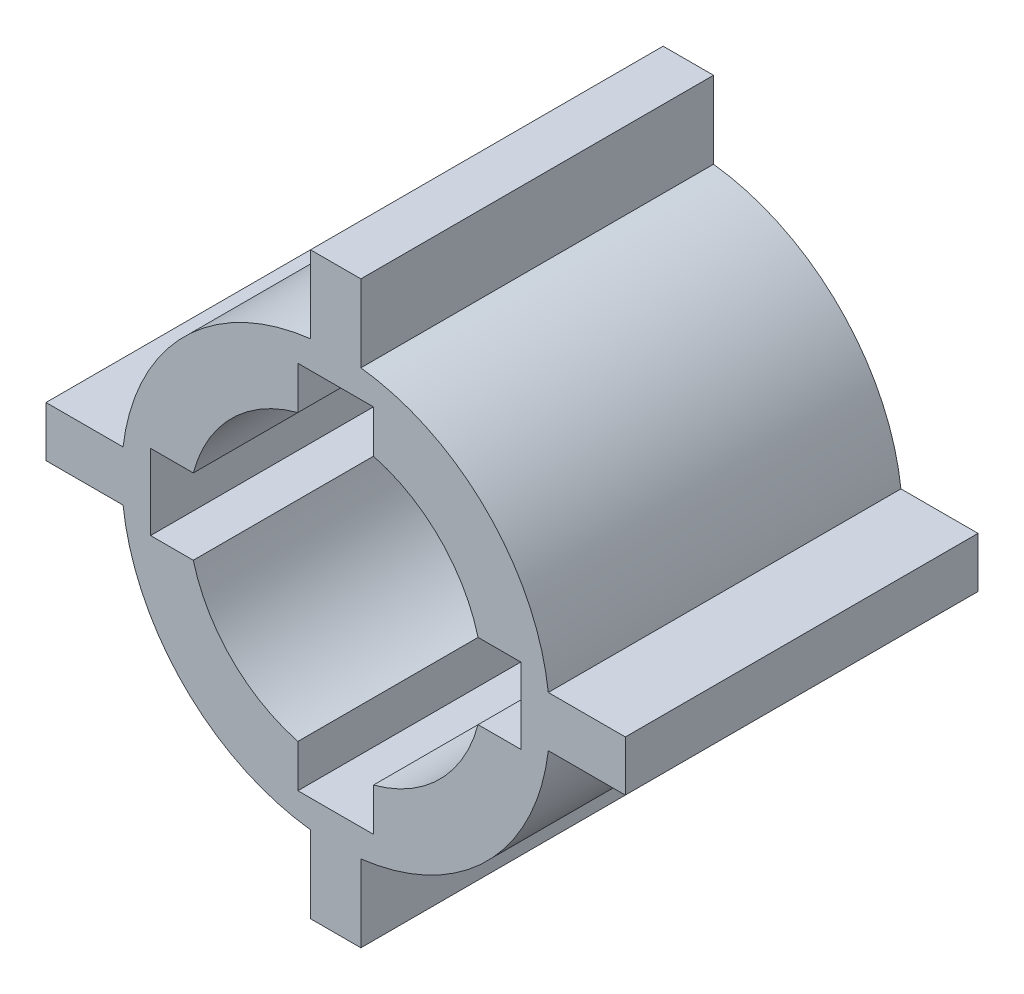
ISO-10303-21;
HEADER;
FILE_DESCRIPTION(('STEP AP214'),'2;1');
FILE_NAME('part.step','',(''),(''),'','','');
FILE_SCHEMA(('AUTOMOTIVE_DESIGN { 1 0 10303 214 1 1 1 1 }'));
ENDSEC;
DATA;
#1=APPLICATION_CONTEXT('core data for automotive mechanical design processes');
#2=APPLICATION_PROTOCOL_DEFINITION('international standard','automotive_design',2000,#1);
#3=PRODUCT_CONTEXT('',#1,'mechanical');
#4=PRODUCT('Part','Part','',(#3));
#5=PRODUCT_RELATED_PRODUCT_CATEGORY('part','',(#4));
#6=PRODUCT_DEFINITION_FORMATION('','',#4);
#7=PRODUCT_DEFINITION_CONTEXT('part definition',#1,'design');
#8=PRODUCT_DEFINITION('design','',#6,#7);
#9=PRODUCT_DEFINITION_SHAPE('','',#8);
#10=(LENGTH_UNIT() NAMED_UNIT(*) SI_UNIT(.MILLI.,.METRE.));
#11=(NAMED_UNIT(*) PLANE_ANGLE_UNIT() SI_UNIT($,.RADIAN.));
#12=(NAMED_UNIT(*) SI_UNIT($,.STERADIAN.) SOLID_ANGLE_UNIT());
#13=UNCERTAINTY_MEASURE_WITH_UNIT(LENGTH_MEASURE(1.E-05),#10,'distance_accuracy_value','');
#14=(GEOMETRIC_REPRESENTATION_CONTEXT(3) GLOBAL_UNCERTAINTY_ASSIGNED_CONTEXT((#13)) GLOBAL_UNIT_ASSIGNED_CONTEXT((#10,
#11,#12)) REPRESENTATION_CONTEXT('',''));
#15=CARTESIAN_POINT('',(0.,0.,0.));
#16=DIRECTION('',(0.,0.,1.));
#17=DIRECTION('',(1.,0.,0.));
#18=AXIS2_PLACEMENT_3D('',#15,#16,#17);
#19=CARTESIAN_POINT('',(0.,0.,14.));
#20=DIRECTION('',(0.,0.,1.));
#21=DIRECTION('',(1.,0.,0.));
#22=AXIS2_PLACEMENT_3D('',#19,#20,#21);
#23=PLANE('',#22);
#24=DIRECTION('',(0.,1.,0.));
#25=VECTOR('',#24,1.);
#26=CARTESIAN_POINT('',(1.,11.5,14.));
#27=LINE('',#26,#25);
#28=CARTESIAN_POINT('',(0.999999999999999,8.44097150806707,14.));
#29=VERTEX_POINT('',#28);
#30=CARTESIAN_POINT('',(1.,11.5,14.));
#31=VERTEX_POINT('',#30);
#32=EDGE_CURVE('E369',#29,#31,#27,.T.);
#33=ORIENTED_EDGE('',*,*,#32,.T.);
#34=DIRECTION('',(-1.,0.,0.));
#35=VECTOR('',#34,1.);
#36=CARTESIAN_POINT('',(-1.,11.5,14.));
#37=LINE('',#36,#35);
#38=CARTESIAN_POINT('',(-1.,11.5,14.));
#39=VERTEX_POINT('',#38);
#40=EDGE_CURVE('E372',#31,#39,#37,.T.);
#41=ORIENTED_EDGE('',*,*,#40,.T.);
#42=DIRECTION('',(0.,-1.,0.));
#43=VECTOR('',#42,1.);
#44=CARTESIAN_POINT('',(-1.,8.44097150806707,14.));
#45=LINE('',#44,#43);
#46=CARTESIAN_POINT('',(-1.,8.44097150806707,14.));
#47=VERTEX_POINT('',#46);
#48=EDGE_CURVE('E375',#39,#47,#45,.T.);
#49=ORIENTED_EDGE('',*,*,#48,.T.);
#50=CARTESIAN_POINT('',(0.,0.,14.));
#51=DIRECTION('',(0.,0.,1.));
#52=DIRECTION('',(1.,0.,0.));
#53=AXIS2_PLACEMENT_3D('',#50,#51,#52);
#54=CIRCLE('',#53,8.5);
#55=CARTESIAN_POINT('',(-8.44097150806707,1.,14.));
#56=VERTEX_POINT('',#55);
#57=EDGE_CURVE('E377',#47,#56,#54,.T.);
#58=ORIENTED_EDGE('',*,*,#57,.T.);
#59=DIRECTION('',(-1.,0.,0.));
#60=VECTOR('',#59,1.);
#61=CARTESIAN_POINT('',(-11.5,1.,14.));
#62=LINE('',#61,#60);
#63=CARTESIAN_POINT('',(-11.5,1.,14.));
#64=VERTEX_POINT('',#63);
#65=EDGE_CURVE('E379',#56,#64,#62,.T.);
#66=ORIENTED_EDGE('',*,*,#65,.T.);
#67=DIRECTION('',(0.,-1.,0.));
#68=VECTOR('',#67,1.);
#69=CARTESIAN_POINT('',(-11.5,-1.,14.));
#70=LINE('',#69,#68);
#71=CARTESIAN_POINT('',(-11.5,-1.,14.));
#72=VERTEX_POINT('',#71);
#73=EDGE_CURVE('E381',#64,#72,#70,.T.);
#74=ORIENTED_EDGE('',*,*,#73,.T.);
#75=DIRECTION('',(1.,0.,0.));
#76=VECTOR('',#75,1.);
#77=CARTESIAN_POINT('',(-8.44097150806707,-1.,14.));
#78=LINE('',#77,#76);
#79=CARTESIAN_POINT('',(-8.44097150806707,-1.,14.));
#80=VERTEX_POINT('',#79);
#81=EDGE_CURVE('E383',#72,#80,#78,.T.);
#82=ORIENTED_EDGE('',*,*,#81,.T.);
#83=CARTESIAN_POINT('',(0.,0.,14.));
#84=DIRECTION('',(0.,0.,1.));
#85=DIRECTION('',(1.,0.,0.));
#86=AXIS2_PLACEMENT_3D('',#83,#84,#85);
#87=CIRCLE('',#86,8.5);
#88=CARTESIAN_POINT('',(-1.,-8.44097150806707,14.));
#89=VERTEX_POINT('',#88);
#90=EDGE_CURVE('E385',#80,#89,#87,.T.);
#91=ORIENTED_EDGE('',*,*,#90,.T.);
#92=DIRECTION('',(0.,-1.,0.));
#93=VECTOR('',#92,1.);
#94=CARTESIAN_POINT('',(-1.,-8.44097150806707,14.));
#95=LINE('',#94,#93);
#96=CARTESIAN_POINT('',(-1.,-11.5,14.));
#97=VERTEX_POINT('',#96);
#98=EDGE_CURVE('E387',#89,#97,#95,.T.);
#99=ORIENTED_EDGE('',*,*,#98,.T.);
#100=DIRECTION('',(1.,0.,0.));
#101=VECTOR('',#100,1.);
#102=CARTESIAN_POINT('',(-1.,-11.5,14.));
#103=LINE('',#102,#101);
#104=CARTESIAN_POINT('',(1.,-11.5,14.));
#105=VERTEX_POINT('',#104);
#106=EDGE_CURVE('E389',#97,#105,#103,.T.);
#107=ORIENTED_EDGE('',*,*,#106,.T.);
#108=DIRECTION('',(0.,1.,0.));
#109=VECTOR('',#108,1.);
#110=CARTESIAN_POINT('',(1.,-11.5,14.));
#111=LINE('',#110,#109);
#112=CARTESIAN_POINT('',(1.,-8.44097150806707,14.));
#113=VERTEX_POINT('',#112);
#114=EDGE_CURVE('E391',#105,#113,#111,.T.);
#115=ORIENTED_EDGE('',*,*,#114,.T.);
#116=CARTESIAN_POINT('',(0.,0.,14.));
#117=DIRECTION('',(0.,0.,1.));
#118=DIRECTION('',(1.,0.,0.));
#119=AXIS2_PLACEMENT_3D('',#116,#117,#118);
#120=CIRCLE('',#119,8.5);
#121=CARTESIAN_POINT('',(8.44097150806707,-1.,14.));
#122=VERTEX_POINT('',#121);
#123=EDGE_CURVE('E393',#113,#122,#120,.T.);
#124=ORIENTED_EDGE('',*,*,#123,.T.);
#125=DIRECTION('',(1.,0.,0.));
#126=VECTOR('',#125,1.);
#127=CARTESIAN_POINT('',(8.44097150806707,-1.,14.));
#128=LINE('',#127,#126);
#129=CARTESIAN_POINT('',(11.5,-1.,14.));
#130=VERTEX_POINT('',#129);
#131=EDGE_CURVE('E395',#122,#130,#128,.T.);
#132=ORIENTED_EDGE('',*,*,#131,.T.);
#133=DIRECTION('',(0.,1.,0.));
#134=VECTOR('',#133,1.);
#135=CARTESIAN_POINT('',(11.5,-1.,14.));
#136=LINE('',#135,#134);
#137=CARTESIAN_POINT('',(11.5,1.,14.));
#138=VERTEX_POINT('',#137);
#139=EDGE_CURVE('E397',#130,#138,#136,.T.);
#140=ORIENTED_EDGE('',*,*,#139,.T.);
#141=DIRECTION('',(-1.,0.,0.));
#142=VECTOR('',#141,1.);
#143=CARTESIAN_POINT('',(11.5,1.,14.));
#144=LINE('',#143,#142);
#145=CARTESIAN_POINT('',(8.44097150806707,1.,14.));
#146=VERTEX_POINT('',#145);
#147=EDGE_CURVE('E399',#138,#146,#144,.T.);
#148=ORIENTED_EDGE('',*,*,#147,.T.);
#149=CARTESIAN_POINT('',(0.,0.,14.));
#150=DIRECTION('',(0.,0.,1.));
#151=DIRECTION('',(1.,0.,0.));
#152=AXIS2_PLACEMENT_3D('',#149,#150,#151);
#153=CIRCLE('',#152,8.5);
#154=EDGE_CURVE('E401',#146,#29,#153,.T.);
#155=ORIENTED_EDGE('',*,*,#154,.T.);
#156=EDGE_LOOP('',(#33,#41,#49,#58,#66,#74,#82,#91,#99,#107,#115,#124,#132,#140,#148,#155));
#157=FACE_BOUND('',#156,.T.);
#158=DIRECTION('',(-1.,0.,0.));
#159=VECTOR('',#158,1.);
#160=CARTESIAN_POINT('',(-1.5,7.34846922834954,14.));
#161=LINE('',#160,#159);
#162=CARTESIAN_POINT('',(1.5,7.34846922834954,14.));
#163=VERTEX_POINT('',#162);
#164=CARTESIAN_POINT('',(-1.5,7.34846922834954,14.));
#165=VERTEX_POINT('',#164);
#166=EDGE_CURVE('E256',#163,#165,#161,.T.);
#167=ORIENTED_EDGE('',*,*,#166,.F.);
#168=DIRECTION('',(0.,1.,0.));
#169=VECTOR('',#168,1.);
#170=CARTESIAN_POINT('',(1.5,7.34846922834954,14.));
#171=LINE('',#170,#169);
#172=CARTESIAN_POINT('',(1.5,5.65283931444645,14.));
#173=VERTEX_POINT('',#172);
#174=EDGE_CURVE('E248',#173,#163,#171,.T.);
#175=ORIENTED_EDGE('',*,*,#174,.F.);
#176=CARTESIAN_POINT('',(0.,0.,14.));
#177=DIRECTION('',(0.,0.,1.));
#178=DIRECTION('',(1.,0.,0.));
#179=AXIS2_PLACEMENT_3D('',#176,#177,#178);
#180=CIRCLE('',#179,5.84846922834953);
#181=CARTESIAN_POINT('',(5.65283931444645,1.5,14.));
#182=VERTEX_POINT('',#181);
#183=EDGE_CURVE('E297',#182,#173,#180,.T.);
#184=ORIENTED_EDGE('',*,*,#183,.F.);
#185=DIRECTION('',(-1.,0.,0.));
#186=VECTOR('',#185,1.);
#187=CARTESIAN_POINT('',(5.65283931444645,1.5,14.));
#188=LINE('',#187,#186);
#189=CARTESIAN_POINT('',(7.34846922834954,1.5,14.));
#190=VERTEX_POINT('',#189);
#191=EDGE_CURVE('E295',#190,#182,#188,.T.);
#192=ORIENTED_EDGE('',*,*,#191,.F.);
#193=DIRECTION('',(0.,1.,0.));
#194=VECTOR('',#193,1.);
#195=CARTESIAN_POINT('',(7.34846922834954,1.5,14.));
#196=LINE('',#195,#194);
#197=CARTESIAN_POINT('',(7.34846922834953,-1.5,14.));
#198=VERTEX_POINT('',#197);
#199=EDGE_CURVE('E293',#198,#190,#196,.T.);
#200=ORIENTED_EDGE('',*,*,#199,.F.);
#201=DIRECTION('',(1.,0.,0.));
#202=VECTOR('',#201,1.);
#203=CARTESIAN_POINT('',(7.34846922834953,-1.5,14.));
#204=LINE('',#203,#202);
#205=CARTESIAN_POINT('',(5.65283931444645,-1.5,14.));
#206=VERTEX_POINT('',#205);
#207=EDGE_CURVE('E291',#206,#198,#204,.T.);
#208=ORIENTED_EDGE('',*,*,#207,.F.);
#209=CARTESIAN_POINT('',(0.,0.,14.));
#210=DIRECTION('',(0.,0.,1.));
#211=DIRECTION('',(1.,0.,0.));
#212=AXIS2_PLACEMENT_3D('',#209,#210,#211);
#213=CIRCLE('',#212,5.84846922834953);
#214=CARTESIAN_POINT('',(1.5,-5.65283931444645,14.));
#215=VERTEX_POINT('',#214);
#216=EDGE_CURVE('E289',#215,#206,#213,.T.);
#217=ORIENTED_EDGE('',*,*,#216,.F.);
#218=DIRECTION('',(0.,1.,0.));
#219=VECTOR('',#218,1.);
#220=CARTESIAN_POINT('',(1.5,-5.65283931444645,14.));
#221=LINE('',#220,#219);
#222=CARTESIAN_POINT('',(1.5,-7.34846922834954,14.));
#223=VERTEX_POINT('',#222);
#224=EDGE_CURVE('E287',#223,#215,#221,.T.);
#225=ORIENTED_EDGE('',*,*,#224,.F.);
#226=DIRECTION('',(1.,0.,0.));
#227=VECTOR('',#226,1.);
#228=CARTESIAN_POINT('',(1.5,-7.34846922834954,14.));
#229=LINE('',#228,#227);
#230=CARTESIAN_POINT('',(-1.5,-7.34846922834954,14.));
#231=VERTEX_POINT('',#230);
#232=EDGE_CURVE('E285',#231,#223,#229,.T.);
#233=ORIENTED_EDGE('',*,*,#232,.F.);
#234=DIRECTION('',(0.,-1.,0.));
#235=VECTOR('',#234,1.);
#236=CARTESIAN_POINT('',(-1.5,-7.34846922834954,14.));
#237=LINE('',#236,#235);
#238=CARTESIAN_POINT('',(-1.5,-5.65283931444645,14.));
#239=VERTEX_POINT('',#238);
#240=EDGE_CURVE('E283',#239,#231,#237,.T.);
#241=ORIENTED_EDGE('',*,*,#240,.F.);
#242=CARTESIAN_POINT('',(0.,0.,14.));
#243=DIRECTION('',(0.,0.,1.));
#244=DIRECTION('',(1.,0.,0.));
#245=AXIS2_PLACEMENT_3D('',#242,#243,#244);
#246=CIRCLE('',#245,5.84846922834953);
#247=CARTESIAN_POINT('',(-5.65283931444645,-1.5,14.));
#248=VERTEX_POINT('',#247);
#249=EDGE_CURVE('E281',#248,#239,#246,.T.);
#250=ORIENTED_EDGE('',*,*,#249,.F.);
#251=DIRECTION('',(1.,0.,0.));
#252=VECTOR('',#251,1.);
#253=CARTESIAN_POINT('',(-5.65283931444645,-1.5,14.));
#254=LINE('',#253,#252);
#255=CARTESIAN_POINT('',(-7.34846922834953,-1.5,14.));
#256=VERTEX_POINT('',#255);
#257=EDGE_CURVE('E279',#256,#248,#254,.T.);
#258=ORIENTED_EDGE('',*,*,#257,.F.);
#259=DIRECTION('',(0.,-1.,0.));
#260=VECTOR('',#259,1.);
#261=CARTESIAN_POINT('',(-7.34846922834953,-1.5,14.));
#262=LINE('',#261,#260);
#263=CARTESIAN_POINT('',(-7.34846922834953,1.5,14.));
#264=VERTEX_POINT('',#263);
#265=EDGE_CURVE('E277',#264,#256,#262,.T.);
#266=ORIENTED_EDGE('',*,*,#265,.F.);
#267=DIRECTION('',(-1.,0.,0.));
#268=VECTOR('',#267,1.);
#269=CARTESIAN_POINT('',(-7.34846922834953,1.5,14.));
#270=LINE('',#269,#268);
#271=CARTESIAN_POINT('',(-5.65283931444645,1.5,14.));
#272=VERTEX_POINT('',#271);
#273=EDGE_CURVE('E275',#272,#264,#270,.T.);
#274=ORIENTED_EDGE('',*,*,#273,.F.);
#275=CARTESIAN_POINT('',(0.,0.,14.));
#276=DIRECTION('',(0.,0.,1.));
#277=DIRECTION('',(1.,0.,0.));
#278=AXIS2_PLACEMENT_3D('',#275,#276,#277);
#279=CIRCLE('',#278,5.84846922834953);
#280=CARTESIAN_POINT('',(-1.5,5.65283931444645,14.));
#281=VERTEX_POINT('',#280);
#282=EDGE_CURVE('E271',#281,#272,#279,.T.);
#283=ORIENTED_EDGE('',*,*,#282,.F.);
#284=DIRECTION('',(0.,-1.,0.));
#285=VECTOR('',#284,1.);
#286=CARTESIAN_POINT('',(-1.5,5.65283931444645,14.));
#287=LINE('',#286,#285);
#288=EDGE_CURVE('E269',#165,#281,#287,.T.);
#289=ORIENTED_EDGE('',*,*,#288,.F.);
#290=EDGE_LOOP('',(#167,#175,#184,#192,#200,#208,#217,#225,#233,#241,#250,#258,#266,#274,#283,#289));
#291=FACE_BOUND('',#290,.T.);
#292=ADVANCED_FACE('F39',(#157,#291),#23,.T.);
#293=CARTESIAN_POINT('',(0.,0.,0.));
#294=DIRECTION('',(0.,0.,1.));
#295=DIRECTION('',(1.,0.,0.));
#296=AXIS2_PLACEMENT_3D('',#293,#294,#295);
#297=PLANE('',#296);
#298=DIRECTION('',(0.,1.,0.));
#299=VECTOR('',#298,1.);
#300=CARTESIAN_POINT('',(1.,11.5,0.));
#301=LINE('',#300,#299);
#302=CARTESIAN_POINT('',(0.999999999999999,8.44097150806707,0.));
#303=VERTEX_POINT('',#302);
#304=CARTESIAN_POINT('',(1.,11.5,0.));
#305=VERTEX_POINT('',#304);
#306=EDGE_CURVE('E264',#303,#305,#301,.T.);
#307=ORIENTED_EDGE('',*,*,#306,.F.);
#308=CARTESIAN_POINT('',(0.,0.,0.));
#309=DIRECTION('',(0.,0.,1.));
#310=DIRECTION('',(1.,0.,0.));
#311=AXIS2_PLACEMENT_3D('',#308,#309,#310);
#312=CIRCLE('',#311,8.5);
#313=CARTESIAN_POINT('',(8.44097150806707,1.,0.));
#314=VERTEX_POINT('',#313);
#315=EDGE_CURVE('E373',#314,#303,#312,.T.);
#316=ORIENTED_EDGE('',*,*,#315,.F.);
#317=DIRECTION('',(-1.,0.,0.));
#318=VECTOR('',#317,1.);
#319=CARTESIAN_POINT('',(11.5,1.,0.));
#320=LINE('',#319,#318);
#321=CARTESIAN_POINT('',(11.5,1.,0.));
#322=VERTEX_POINT('',#321);
#323=EDGE_CURVE('E432',#322,#314,#320,.T.);
#324=ORIENTED_EDGE('',*,*,#323,.F.);
#325=DIRECTION('',(0.,1.,0.));
#326=VECTOR('',#325,1.);
#327=CARTESIAN_POINT('',(11.5,-1.,0.));
#328=LINE('',#327,#326);
#329=CARTESIAN_POINT('',(11.5,-1.,0.));
#330=VERTEX_POINT('',#329);
#331=EDGE_CURVE('E430',#330,#322,#328,.T.);
#332=ORIENTED_EDGE('',*,*,#331,.F.);
#333=DIRECTION('',(1.,0.,0.));
#334=VECTOR('',#333,1.);
#335=CARTESIAN_POINT('',(8.44097150806707,-1.,0.));
#336=LINE('',#335,#334);
#337=CARTESIAN_POINT('',(8.44097150806707,-1.,0.));
#338=VERTEX_POINT('',#337);
#339=EDGE_CURVE('E428',#338,#330,#336,.T.);
#340=ORIENTED_EDGE('',*,*,#339,.F.);
#341=CARTESIAN_POINT('',(0.,0.,0.));
#342=DIRECTION('',(0.,0.,1.));
#343=DIRECTION('',(1.,0.,0.));
#344=AXIS2_PLACEMENT_3D('',#341,#342,#343);
#345=CIRCLE('',#344,8.5);
#346=CARTESIAN_POINT('',(1.,-8.44097150806707,0.));
#347=VERTEX_POINT('',#346);
#348=EDGE_CURVE('E426',#347,#338,#345,.T.);
#349=ORIENTED_EDGE('',*,*,#348,.F.);
#350=DIRECTION('',(0.,1.,0.));
#351=VECTOR('',#350,1.);
#352=CARTESIAN_POINT('',(1.,-11.5,0.));
#353=LINE('',#352,#351);
#354=CARTESIAN_POINT('',(1.,-11.5,0.));
#355=VERTEX_POINT('',#354);
#356=EDGE_CURVE('E424',#355,#347,#353,.T.);
#357=ORIENTED_EDGE('',*,*,#356,.F.);
#358=DIRECTION('',(1.,0.,0.));
#359=VECTOR('',#358,1.);
#360=CARTESIAN_POINT('',(-1.,-11.5,0.));
#361=LINE('',#360,#359);
#362=CARTESIAN_POINT('',(-1.,-11.5,0.));
#363=VERTEX_POINT('',#362);
#364=EDGE_CURVE('E422',#363,#355,#361,.T.);
#365=ORIENTED_EDGE('',*,*,#364,.F.);
#366=DIRECTION('',(0.,-1.,0.));
#367=VECTOR('',#366,1.);
#368=CARTESIAN_POINT('',(-1.,-8.44097150806707,0.));
#369=LINE('',#368,#367);
#370=CARTESIAN_POINT('',(-1.,-8.44097150806707,0.));
#371=VERTEX_POINT('',#370);
#372=EDGE_CURVE('E420',#371,#363,#369,.T.);
#373=ORIENTED_EDGE('',*,*,#372,.F.);
#374=CARTESIAN_POINT('',(0.,0.,0.));
#375=DIRECTION('',(0.,0.,1.));
#376=DIRECTION('',(1.,0.,0.));
#377=AXIS2_PLACEMENT_3D('',#374,#375,#376);
#378=CIRCLE('',#377,8.5);
#379=CARTESIAN_POINT('',(-8.44097150806707,-1.,0.));
#380=VERTEX_POINT('',#379);
#381=EDGE_CURVE('E418',#380,#371,#378,.T.);
#382=ORIENTED_EDGE('',*,*,#381,.F.);
#383=DIRECTION('',(1.,0.,0.));
#384=VECTOR('',#383,1.);
#385=CARTESIAN_POINT('',(-8.44097150806707,-1.,0.));
#386=LINE('',#385,#384);
#387=CARTESIAN_POINT('',(-11.5,-1.,0.));
#388=VERTEX_POINT('',#387);
#389=EDGE_CURVE('E416',#388,#380,#386,.T.);
#390=ORIENTED_EDGE('',*,*,#389,.F.);
#391=DIRECTION('',(0.,-1.,0.));
#392=VECTOR('',#391,1.);
#393=CARTESIAN_POINT('',(-11.5,-1.,0.));
#394=LINE('',#393,#392);
#395=CARTESIAN_POINT('',(-11.5,1.,0.));
#396=VERTEX_POINT('',#395);
#397=EDGE_CURVE('E414',#396,#388,#394,.T.);
#398=ORIENTED_EDGE('',*,*,#397,.F.);
#399=DIRECTION('',(-1.,0.,0.));
#400=VECTOR('',#399,1.);
#401=CARTESIAN_POINT('',(-11.5,1.,0.));
#402=LINE('',#401,#400);
#403=CARTESIAN_POINT('',(-8.44097150806707,1.,0.));
#404=VERTEX_POINT('',#403);
#405=EDGE_CURVE('E412',#404,#396,#402,.T.);
#406=ORIENTED_EDGE('',*,*,#405,.F.);
#407=CARTESIAN_POINT('',(0.,0.,0.));
#408=DIRECTION('',(0.,0.,1.));
#409=DIRECTION('',(1.,0.,0.));
#410=AXIS2_PLACEMENT_3D('',#407,#408,#409);
#411=CIRCLE('',#410,8.5);
#412=CARTESIAN_POINT('',(-1.,8.44097150806707,0.));
#413=VERTEX_POINT('',#412);
#414=EDGE_CURVE('E410',#413,#404,#411,.T.);
#415=ORIENTED_EDGE('',*,*,#414,.F.);
#416=DIRECTION('',(0.,-1.,0.));
#417=VECTOR('',#416,1.);
#418=CARTESIAN_POINT('',(-1.,8.44097150806707,0.));
#419=LINE('',#418,#417);
#420=CARTESIAN_POINT('',(-1.,11.5,0.));
#421=VERTEX_POINT('',#420);
#422=EDGE_CURVE('E408',#421,#413,#419,.T.);
#423=ORIENTED_EDGE('',*,*,#422,.F.);
#424=DIRECTION('',(-1.,0.,0.));
#425=VECTOR('',#424,1.);
#426=CARTESIAN_POINT('',(-1.,11.5,0.));
#427=LINE('',#426,#425);
#428=EDGE_CURVE('E406',#305,#421,#427,.T.);
#429=ORIENTED_EDGE('',*,*,#428,.F.);
#430=EDGE_LOOP('',(#307,#316,#324,#332,#340,#349,#357,#365,#373,#382,#390,#398,#406,#415,#423,#429));
#431=FACE_BOUND('',#430,.T.);
#432=DIRECTION('',(0.,1.,0.));
#433=VECTOR('',#432,1.);
#434=CARTESIAN_POINT('',(1.5,7.34846922834954,0.));
#435=LINE('',#434,#433);
#436=CARTESIAN_POINT('',(1.5,5.65283931444645,0.));
#437=VERTEX_POINT('',#436);
#438=CARTESIAN_POINT('',(1.5,7.34846922834954,0.));
#439=VERTEX_POINT('',#438);
#440=EDGE_CURVE('E62',#437,#439,#435,.T.);
#441=ORIENTED_EDGE('',*,*,#440,.T.);
#442=DIRECTION('',(-1.,0.,0.));
#443=VECTOR('',#442,1.);
#444=CARTESIAN_POINT('',(-1.5,7.34846922834954,0.));
#445=LINE('',#444,#443);
#446=CARTESIAN_POINT('',(-1.5,7.34846922834954,0.));
#447=VERTEX_POINT('',#446);
#448=EDGE_CURVE('E263',#439,#447,#445,.T.);
#449=ORIENTED_EDGE('',*,*,#448,.T.);
#450=DIRECTION('',(0.,-1.,0.));
#451=VECTOR('',#450,1.);
#452=CARTESIAN_POINT('',(-1.5,5.65283931444645,0.));
#453=LINE('',#452,#451);
#454=CARTESIAN_POINT('',(-1.5,5.65283931444645,0.));
#455=VERTEX_POINT('',#454);
#456=EDGE_CURVE('E301',#447,#455,#453,.T.);
#457=ORIENTED_EDGE('',*,*,#456,.T.);
#458=CARTESIAN_POINT('',(0.,0.,0.));
#459=DIRECTION('',(0.,0.,1.));
#460=DIRECTION('',(1.,0.,0.));
#461=AXIS2_PLACEMENT_3D('',#458,#459,#460);
#462=CIRCLE('',#461,5.84846922834953);
#463=CARTESIAN_POINT('',(-5.65283931444645,1.5,0.));
#464=VERTEX_POINT('',#463);
#465=EDGE_CURVE('E304',#455,#464,#462,.T.);
#466=ORIENTED_EDGE('',*,*,#465,.T.);
#467=DIRECTION('',(-1.,0.,0.));
#468=VECTOR('',#467,1.);
#469=CARTESIAN_POINT('',(-7.34846922834953,1.5,0.));
#470=LINE('',#469,#468);
#471=CARTESIAN_POINT('',(-7.34846922834953,1.5,0.));
#472=VERTEX_POINT('',#471);
#473=EDGE_CURVE('E307',#464,#472,#470,.T.);
#474=ORIENTED_EDGE('',*,*,#473,.T.);
#475=DIRECTION('',(0.,-1.,0.));
#476=VECTOR('',#475,1.);
#477=CARTESIAN_POINT('',(-7.34846922834953,-1.5,0.));
#478=LINE('',#477,#476);
#479=CARTESIAN_POINT('',(-7.34846922834953,-1.5,0.));
#480=VERTEX_POINT('',#479);
#481=EDGE_CURVE('E310',#472,#480,#478,.T.);
#482=ORIENTED_EDGE('',*,*,#481,.T.);
#483=DIRECTION('',(1.,0.,0.));
#484=VECTOR('',#483,1.);
#485=CARTESIAN_POINT('',(-5.65283931444645,-1.5,0.));
#486=LINE('',#485,#484);
#487=CARTESIAN_POINT('',(-5.65283931444645,-1.5,0.));
#488=VERTEX_POINT('',#487);
#489=EDGE_CURVE('E313',#480,#488,#486,.T.);
#490=ORIENTED_EDGE('',*,*,#489,.T.);
#491=CARTESIAN_POINT('',(0.,0.,0.));
#492=DIRECTION('',(0.,0.,1.));
#493=DIRECTION('',(1.,0.,0.));
#494=AXIS2_PLACEMENT_3D('',#491,#492,#493);
#495=CIRCLE('',#494,5.84846922834953);
#496=CARTESIAN_POINT('',(-1.5,-5.65283931444645,0.));
#497=VERTEX_POINT('',#496);
#498=EDGE_CURVE('E316',#488,#497,#495,.T.);
#499=ORIENTED_EDGE('',*,*,#498,.T.);
#500=DIRECTION('',(0.,-1.,0.));
#501=VECTOR('',#500,1.);
#502=CARTESIAN_POINT('',(-1.5,-7.34846922834954,0.));
#503=LINE('',#502,#501);
#504=CARTESIAN_POINT('',(-1.5,-7.34846922834954,0.));
#505=VERTEX_POINT('',#504);
#506=EDGE_CURVE('E319',#497,#505,#503,.T.);
#507=ORIENTED_EDGE('',*,*,#506,.T.);
#508=DIRECTION('',(1.,0.,0.));
#509=VECTOR('',#508,1.);
#510=CARTESIAN_POINT('',(1.5,-7.34846922834954,0.));
#511=LINE('',#510,#509);
#512=CARTESIAN_POINT('',(1.5,-7.34846922834954,0.));
#513=VERTEX_POINT('',#512);
#514=EDGE_CURVE('E322',#505,#513,#511,.T.);
#515=ORIENTED_EDGE('',*,*,#514,.T.);
#516=DIRECTION('',(0.,1.,0.));
#517=VECTOR('',#516,1.);
#518=CARTESIAN_POINT('',(1.5,-5.65283931444645,0.));
#519=LINE('',#518,#517);
#520=CARTESIAN_POINT('',(1.5,-5.65283931444645,0.));
#521=VERTEX_POINT('',#520);
#522=EDGE_CURVE('E325',#513,#521,#519,.T.);
#523=ORIENTED_EDGE('',*,*,#522,.T.);
#524=CARTESIAN_POINT('',(0.,0.,0.));
#525=DIRECTION('',(0.,0.,1.));
#526=DIRECTION('',(1.,0.,0.));
#527=AXIS2_PLACEMENT_3D('',#524,#525,#526);
#528=CIRCLE('',#527,5.84846922834953);
#529=CARTESIAN_POINT('',(5.65283931444645,-1.5,0.));
#530=VERTEX_POINT('',#529);
#531=EDGE_CURVE('E328',#521,#530,#528,.T.);
#532=ORIENTED_EDGE('',*,*,#531,.T.);
#533=DIRECTION('',(1.,0.,0.));
#534=VECTOR('',#533,1.);
#535=CARTESIAN_POINT('',(7.34846922834953,-1.5,0.));
#536=LINE('',#535,#534);
#537=CARTESIAN_POINT('',(7.34846922834953,-1.5,0.));
#538=VERTEX_POINT('',#537);
#539=EDGE_CURVE('E331',#530,#538,#536,.T.);
#540=ORIENTED_EDGE('',*,*,#539,.T.);
#541=DIRECTION('',(0.,1.,0.));
#542=VECTOR('',#541,1.);
#543=CARTESIAN_POINT('',(7.34846922834954,1.5,0.));
#544=LINE('',#543,#542);
#545=CARTESIAN_POINT('',(7.34846922834954,1.5,0.));
#546=VERTEX_POINT('',#545);
#547=EDGE_CURVE('E334',#538,#546,#544,.T.);
#548=ORIENTED_EDGE('',*,*,#547,.T.);
#549=DIRECTION('',(-1.,0.,0.));
#550=VECTOR('',#549,1.);
#551=CARTESIAN_POINT('',(5.65283931444645,1.5,0.));
#552=LINE('',#551,#550);
#553=CARTESIAN_POINT('',(5.65283931444645,1.5,0.));
#554=VERTEX_POINT('',#553);
#555=EDGE_CURVE('E337',#546,#554,#552,.T.);
#556=ORIENTED_EDGE('',*,*,#555,.T.);
#557=CARTESIAN_POINT('',(0.,0.,0.));
#558=DIRECTION('',(0.,0.,1.));
#559=DIRECTION('',(1.,0.,0.));
#560=AXIS2_PLACEMENT_3D('',#557,#558,#559);
#561=CIRCLE('',#560,5.84846922834953);
#562=EDGE_CURVE('E257',#554,#437,#561,.T.);
#563=ORIENTED_EDGE('',*,*,#562,.T.);
#564=EDGE_LOOP('',(#441,#449,#457,#466,#474,#482,#490,#499,#507,#515,#523,#532,#540,#548,#556,#563));
#565=FACE_BOUND('',#564,.T.);
#566=ADVANCED_FACE('F486',(#431,#565),#297,.F.);
#567=CARTESIAN_POINT('',(1.,11.5,14.));
#568=DIRECTION('',(-1.,0.,0.));
#569=DIRECTION('',(0.,-1.,0.));
#570=AXIS2_PLACEMENT_3D('',#567,#568,#569);
#571=PLANE('',#570);
#572=ORIENTED_EDGE('',*,*,#306,.T.);
#573=DIRECTION('',(0.,0.,-1.));
#574=VECTOR('',#573,1.);
#575=CARTESIAN_POINT('',(1.,11.5,14.));
#576=LINE('',#575,#574);
#577=EDGE_CURVE('E11',#31,#305,#576,.T.);
#578=ORIENTED_EDGE('',*,*,#577,.F.);
#579=ORIENTED_EDGE('',*,*,#32,.F.);
#580=DIRECTION('',(0.,0.,-1.));
#581=VECTOR('',#580,1.);
#582=CARTESIAN_POINT('',(0.999999999999999,8.44097150806707,14.));
#583=LINE('',#582,#581);
#584=EDGE_CURVE('E403',#29,#303,#583,.T.);
#585=ORIENTED_EDGE('',*,*,#584,.T.);
#586=EDGE_LOOP('',(#572,#578,#579,#585));
#587=FACE_BOUND('',#586,.T.);
#588=ADVANCED_FACE('F41',(#587),#571,.F.);
#589=CARTESIAN_POINT('',(-1.,11.5,14.));
#590=DIRECTION('',(0.,-1.,0.));
#591=DIRECTION('',(0.,0.,-1.));
#592=AXIS2_PLACEMENT_3D('',#589,#590,#591);
#593=PLANE('',#592);
#594=ORIENTED_EDGE('',*,*,#428,.T.);
#595=DIRECTION('',(0.,0.,-1.));
#596=VECTOR('',#595,1.);
#597=CARTESIAN_POINT('',(-1.,11.5,14.));
#598=LINE('',#597,#596);
#599=EDGE_CURVE('E47',#39,#421,#598,.T.);
#600=ORIENTED_EDGE('',*,*,#599,.F.);
#601=ORIENTED_EDGE('',*,*,#40,.F.);
#602=ORIENTED_EDGE('',*,*,#577,.T.);
#603=EDGE_LOOP('',(#594,#600,#601,#602));
#604=FACE_BOUND('',#603,.T.);
#605=ADVANCED_FACE('F503',(#604),#593,.F.);
#606=CARTESIAN_POINT('',(-1.,8.44097150806707,14.));
#607=DIRECTION('',(1.,0.,0.));
#608=DIRECTION('',(0.,1.,0.));
#609=AXIS2_PLACEMENT_3D('',#606,#607,#608);
#610=PLANE('',#609);
#611=ORIENTED_EDGE('',*,*,#422,.T.);
#612=DIRECTION('',(0.,0.,-1.));
#613=VECTOR('',#612,1.);
#614=CARTESIAN_POINT('',(-1.,8.44097150806707,14.));
#615=LINE('',#614,#613);
#616=EDGE_CURVE('E473',#47,#413,#615,.T.);
#617=ORIENTED_EDGE('',*,*,#616,.F.);
#618=ORIENTED_EDGE('',*,*,#48,.F.);
#619=ORIENTED_EDGE('',*,*,#599,.T.);
#620=EDGE_LOOP('',(#611,#617,#618,#619));
#621=FACE_BOUND('',#620,.T.);
#622=ADVANCED_FACE('F480',(#621),#610,.F.);
#623=CARTESIAN_POINT('',(0.,0.,14.));
#624=DIRECTION('',(0.,0.,-1.));
#625=DIRECTION('',(-1.,0.,0.));
#626=AXIS2_PLACEMENT_3D('',#623,#624,#625);
#627=CYLINDRICAL_SURFACE('',#626,8.5);
#628=ORIENTED_EDGE('',*,*,#414,.T.);
#629=DIRECTION('',(0.,0.,-1.));
#630=VECTOR('',#629,1.);
#631=CARTESIAN_POINT('',(-8.44097150806707,1.,14.));
#632=LINE('',#631,#630);
#633=EDGE_CURVE('E470',#56,#404,#632,.T.);
#634=ORIENTED_EDGE('',*,*,#633,.F.);
#635=ORIENTED_EDGE('',*,*,#57,.F.);
#636=ORIENTED_EDGE('',*,*,#616,.T.);
#637=EDGE_LOOP('',(#628,#634,#635,#636));
#638=FACE_BOUND('',#637,.T.);
#639=ADVANCED_FACE('F492',(#638),#627,.T.);
#640=CARTESIAN_POINT('',(-11.5,1.,14.));
#641=DIRECTION('',(0.,-1.,0.));
#642=DIRECTION('',(1.,0.,0.));
#643=AXIS2_PLACEMENT_3D('',#640,#641,#642);
#644=PLANE('',#643);
#645=ORIENTED_EDGE('',*,*,#405,.T.);
#646=DIRECTION('',(0.,0.,-1.));
#647=VECTOR('',#646,1.);
#648=CARTESIAN_POINT('',(-11.5,1.,14.));
#649=LINE('',#648,#647);
#650=EDGE_CURVE('E467',#64,#396,#649,.T.);
#651=ORIENTED_EDGE('',*,*,#650,.F.);
#652=ORIENTED_EDGE('',*,*,#65,.F.);
#653=ORIENTED_EDGE('',*,*,#633,.T.);
#654=EDGE_LOOP('',(#645,#651,#652,#653));
#655=FACE_BOUND('',#654,.T.);
#656=ADVANCED_FACE('F496',(#655),#644,.F.);
#657=CARTESIAN_POINT('',(-11.5,-1.,14.));
#658=DIRECTION('',(1.,0.,0.));
#659=DIRECTION('',(0.,0.,-1.));
#660=AXIS2_PLACEMENT_3D('',#657,#658,#659);
#661=PLANE('',#660);
#662=ORIENTED_EDGE('',*,*,#397,.T.);
#663=DIRECTION('',(0.,0.,-1.));
#664=VECTOR('',#663,1.);
#665=CARTESIAN_POINT('',(-11.5,-1.,14.));
#666=LINE('',#665,#664);
#667=EDGE_CURVE('E464',#72,#388,#666,.T.);
#668=ORIENTED_EDGE('',*,*,#667,.F.);
#669=ORIENTED_EDGE('',*,*,#73,.F.);
#670=ORIENTED_EDGE('',*,*,#650,.T.);
#671=EDGE_LOOP('',(#662,#668,#669,#670));
#672=FACE_BOUND('',#671,.T.);
#673=ADVANCED_FACE('F556',(#672),#661,.F.);
#674=CARTESIAN_POINT('',(-8.44097150806707,-1.,14.));
#675=DIRECTION('',(0.,1.,0.));
#676=DIRECTION('',(-1.,0.,0.));
#677=AXIS2_PLACEMENT_3D('',#674,#675,#676);
#678=PLANE('',#677);
#679=ORIENTED_EDGE('',*,*,#389,.T.);
#680=DIRECTION('',(0.,0.,-1.));
#681=VECTOR('',#680,1.);
#682=CARTESIAN_POINT('',(-8.44097150806707,-1.,14.));
#683=LINE('',#682,#681);
#684=EDGE_CURVE('E461',#80,#380,#683,.T.);
#685=ORIENTED_EDGE('',*,*,#684,.F.);
#686=ORIENTED_EDGE('',*,*,#81,.F.);
#687=ORIENTED_EDGE('',*,*,#667,.T.);
#688=EDGE_LOOP('',(#679,#685,#686,#687));
#689=FACE_BOUND('',#688,.T.);
#690=ADVANCED_FACE('F553',(#689),#678,.F.);
#691=CARTESIAN_POINT('',(0.,0.,14.));
#692=DIRECTION('',(0.,0.,-1.));
#693=DIRECTION('',(-1.,0.,0.));
#694=AXIS2_PLACEMENT_3D('',#691,#692,#693);
#695=CYLINDRICAL_SURFACE('',#694,8.5);
#696=ORIENTED_EDGE('',*,*,#381,.T.);
#697=DIRECTION('',(0.,0.,-1.));
#698=VECTOR('',#697,1.);
#699=CARTESIAN_POINT('',(-1.,-8.44097150806707,14.));
#700=LINE('',#699,#698);
#701=EDGE_CURVE('E458',#89,#371,#700,.T.);
#702=ORIENTED_EDGE('',*,*,#701,.F.);
#703=ORIENTED_EDGE('',*,*,#90,.F.);
#704=ORIENTED_EDGE('',*,*,#684,.T.);
#705=EDGE_LOOP('',(#696,#702,#703,#704));
#706=FACE_BOUND('',#705,.T.);
#707=ADVANCED_FACE('F549',(#706),#695,.T.);
#708=CARTESIAN_POINT('',(-1.,-8.44097150806707,14.));
#709=DIRECTION('',(1.,0.,0.));
#710=DIRECTION('',(0.,0.,-1.));
#711=AXIS2_PLACEMENT_3D('',#708,#709,#710);
#712=PLANE('',#711);
#713=ORIENTED_EDGE('',*,*,#372,.T.);
#714=DIRECTION('',(0.,0.,-1.));
#715=VECTOR('',#714,1.);
#716=CARTESIAN_POINT('',(-1.,-11.5,14.));
#717=LINE('',#716,#715);
#718=EDGE_CURVE('E455',#97,#363,#717,.T.);
#719=ORIENTED_EDGE('',*,*,#718,.F.);
#720=ORIENTED_EDGE('',*,*,#98,.F.);
#721=ORIENTED_EDGE('',*,*,#701,.T.);
#722=EDGE_LOOP('',(#713,#719,#720,#721));
#723=FACE_BOUND('',#722,.T.);
#724=ADVANCED_FACE('F545',(#723),#712,.F.);
#725=CARTESIAN_POINT('',(-1.,-11.5,14.));
#726=DIRECTION('',(0.,1.,0.));
#727=DIRECTION('',(0.,0.,1.));
#728=AXIS2_PLACEMENT_3D('',#725,#726,#727);
#729=PLANE('',#728);
#730=ORIENTED_EDGE('',*,*,#364,.T.);
#731=DIRECTION('',(0.,0.,-1.));
#732=VECTOR('',#731,1.);
#733=CARTESIAN_POINT('',(1.,-11.5,14.));
#734=LINE('',#733,#732);
#735=EDGE_CURVE('E452',#105,#355,#734,.T.);
#736=ORIENTED_EDGE('',*,*,#735,.F.);
#737=ORIENTED_EDGE('',*,*,#106,.F.);
#738=ORIENTED_EDGE('',*,*,#718,.T.);
#739=EDGE_LOOP('',(#730,#736,#737,#738));
#740=FACE_BOUND('',#739,.T.);
#741=ADVANCED_FACE('F540',(#740),#729,.F.);
#742=CARTESIAN_POINT('',(1.,-11.5,14.));
#743=DIRECTION('',(-1.,0.,0.));
#744=DIRECTION('',(0.,0.,1.));
#745=AXIS2_PLACEMENT_3D('',#742,#743,#744);
#746=PLANE('',#745);
#747=ORIENTED_EDGE('',*,*,#356,.T.);
#748=DIRECTION('',(0.,0.,-1.));
#749=VECTOR('',#748,1.);
#750=CARTESIAN_POINT('',(1.,-8.44097150806707,14.));
#751=LINE('',#750,#749);
#752=EDGE_CURVE('E449',#113,#347,#751,.T.);
#753=ORIENTED_EDGE('',*,*,#752,.F.);
#754=ORIENTED_EDGE('',*,*,#114,.F.);
#755=ORIENTED_EDGE('',*,*,#735,.T.);
#756=EDGE_LOOP('',(#747,#753,#754,#755));
#757=FACE_BOUND('',#756,.T.);
#758=ADVANCED_FACE('F534',(#757),#746,.F.);
#759=CARTESIAN_POINT('',(0.,0.,14.));
#760=DIRECTION('',(0.,0.,-1.));
#761=DIRECTION('',(-1.,0.,0.));
#762=AXIS2_PLACEMENT_3D('',#759,#760,#761);
#763=CYLINDRICAL_SURFACE('',#762,8.5);
#764=ORIENTED_EDGE('',*,*,#348,.T.);
#765=DIRECTION('',(0.,0.,-1.));
#766=VECTOR('',#765,1.);
#767=CARTESIAN_POINT('',(8.44097150806707,-1.,14.));
#768=LINE('',#767,#766);
#769=EDGE_CURVE('E446',#122,#338,#768,.T.);
#770=ORIENTED_EDGE('',*,*,#769,.F.);
#771=ORIENTED_EDGE('',*,*,#123,.F.);
#772=ORIENTED_EDGE('',*,*,#752,.T.);
#773=EDGE_LOOP('',(#764,#770,#771,#772));
#774=FACE_BOUND('',#773,.T.);
#775=ADVANCED_FACE('F530',(#774),#763,.T.);
#776=CARTESIAN_POINT('',(8.44097150806707,-1.,14.));
#777=DIRECTION('',(0.,1.,0.));
#778=DIRECTION('',(-1.,0.,0.));
#779=AXIS2_PLACEMENT_3D('',#776,#777,#778);
#780=PLANE('',#779);
#781=ORIENTED_EDGE('',*,*,#339,.T.);
#782=DIRECTION('',(0.,0.,-1.));
#783=VECTOR('',#782,1.);
#784=CARTESIAN_POINT('',(11.5,-1.,14.));
#785=LINE('',#784,#783);
#786=EDGE_CURVE('E443',#130,#330,#785,.T.);
#787=ORIENTED_EDGE('',*,*,#786,.F.);
#788=ORIENTED_EDGE('',*,*,#131,.F.);
#789=ORIENTED_EDGE('',*,*,#769,.T.);
#790=EDGE_LOOP('',(#781,#787,#788,#789));
#791=FACE_BOUND('',#790,.T.);
#792=ADVANCED_FACE('F525',(#791),#780,.F.);
#793=CARTESIAN_POINT('',(11.5,-1.,14.));
#794=DIRECTION('',(-1.,0.,0.));
#795=DIRECTION('',(0.,0.,1.));
#796=AXIS2_PLACEMENT_3D('',#793,#794,#795);
#797=PLANE('',#796);
#798=ORIENTED_EDGE('',*,*,#331,.T.);
#799=DIRECTION('',(0.,0.,-1.));
#800=VECTOR('',#799,1.);
#801=CARTESIAN_POINT('',(11.5,1.,14.));
#802=LINE('',#801,#800);
#803=EDGE_CURVE('E440',#138,#322,#802,.T.);
#804=ORIENTED_EDGE('',*,*,#803,.F.);
#805=ORIENTED_EDGE('',*,*,#139,.F.);
#806=ORIENTED_EDGE('',*,*,#786,.T.);
#807=EDGE_LOOP('',(#798,#804,#805,#806));
#808=FACE_BOUND('',#807,.T.);
#809=ADVANCED_FACE('F519',(#808),#797,.F.);
#810=CARTESIAN_POINT('',(11.5,1.,14.));
#811=DIRECTION('',(0.,-1.,0.));
#812=DIRECTION('',(1.,0.,0.));
#813=AXIS2_PLACEMENT_3D('',#810,#811,#812);
#814=PLANE('',#813);
#815=ORIENTED_EDGE('',*,*,#323,.T.);
#816=DIRECTION('',(0.,0.,-1.));
#817=VECTOR('',#816,1.);
#818=CARTESIAN_POINT('',(8.44097150806707,1.,14.));
#819=LINE('',#818,#817);
#820=EDGE_CURVE('E437',#146,#314,#819,.T.);
#821=ORIENTED_EDGE('',*,*,#820,.F.);
#822=ORIENTED_EDGE('',*,*,#147,.F.);
#823=ORIENTED_EDGE('',*,*,#803,.T.);
#824=EDGE_LOOP('',(#815,#821,#822,#823));
#825=FACE_BOUND('',#824,.T.);
#826=ADVANCED_FACE('F515',(#825),#814,.F.);
#827=CARTESIAN_POINT('',(0.,0.,14.));
#828=DIRECTION('',(0.,0.,-1.));
#829=DIRECTION('',(-1.,0.,0.));
#830=AXIS2_PLACEMENT_3D('',#827,#828,#829);
#831=CYLINDRICAL_SURFACE('',#830,8.5);
#832=ORIENTED_EDGE('',*,*,#315,.T.);
#833=ORIENTED_EDGE('',*,*,#584,.F.);
#834=ORIENTED_EDGE('',*,*,#154,.F.);
#835=ORIENTED_EDGE('',*,*,#820,.T.);
#836=EDGE_LOOP('',(#832,#833,#834,#835));
#837=FACE_BOUND('',#836,.T.);
#838=ADVANCED_FACE('F510',(#837),#831,.T.);
#839=CARTESIAN_POINT('',(1.5,7.34846922834954,14.));
#840=DIRECTION('',(-1.,0.,0.));
#841=DIRECTION('',(0.,0.,1.));
#842=AXIS2_PLACEMENT_3D('',#839,#840,#841);
#843=PLANE('',#842);
#844=ORIENTED_EDGE('',*,*,#440,.F.);
#845=DIRECTION('',(0.,0.,-1.));
#846=VECTOR('',#845,1.);
#847=CARTESIAN_POINT('',(1.5,5.65283931444645,14.));
#848=LINE('',#847,#846);
#849=EDGE_CURVE('E252',#173,#437,#848,.T.);
#850=ORIENTED_EDGE('',*,*,#849,.F.);
#851=ORIENTED_EDGE('',*,*,#174,.T.);
#852=DIRECTION('',(0.,0.,-1.));
#853=VECTOR('',#852,1.);
#854=CARTESIAN_POINT('',(1.5,7.34846922834954,14.));
#855=LINE('',#854,#853);
#856=EDGE_CURVE('E251',#163,#439,#855,.T.);
#857=ORIENTED_EDGE('',*,*,#856,.T.);
#858=EDGE_LOOP('',(#844,#850,#851,#857));
#859=FACE_BOUND('',#858,.T.);
#860=ADVANCED_FACE('F250',(#859),#843,.T.);
#861=CARTESIAN_POINT('',(-1.5,7.34846922834954,14.));
#862=DIRECTION('',(0.,-1.,0.));
#863=DIRECTION('',(0.,0.,-1.));
#864=AXIS2_PLACEMENT_3D('',#861,#862,#863);
#865=PLANE('',#864);
#866=ORIENTED_EDGE('',*,*,#448,.F.);
#867=ORIENTED_EDGE('',*,*,#856,.F.);
#868=ORIENTED_EDGE('',*,*,#166,.T.);
#869=DIRECTION('',(0.,0.,-1.));
#870=VECTOR('',#869,1.);
#871=CARTESIAN_POINT('',(-1.5,7.34846922834954,14.));
#872=LINE('',#871,#870);
#873=EDGE_CURVE('E265',#165,#447,#872,.T.);
#874=ORIENTED_EDGE('',*,*,#873,.T.);
#875=EDGE_LOOP('',(#866,#867,#868,#874));
#876=FACE_BOUND('',#875,.T.);
#877=ADVANCED_FACE('F260',(#876),#865,.T.);
#878=CARTESIAN_POINT('',(-1.5,5.65283931444645,14.));
#879=DIRECTION('',(1.,0.,0.));
#880=DIRECTION('',(0.,0.,-1.));
#881=AXIS2_PLACEMENT_3D('',#878,#879,#880);
#882=PLANE('',#881);
#883=ORIENTED_EDGE('',*,*,#456,.F.);
#884=ORIENTED_EDGE('',*,*,#873,.F.);
#885=ORIENTED_EDGE('',*,*,#288,.T.);
#886=DIRECTION('',(0.,0.,-1.));
#887=VECTOR('',#886,1.);
#888=CARTESIAN_POINT('',(-1.5,5.65283931444645,14.));
#889=LINE('',#888,#887);
#890=EDGE_CURVE('E366',#281,#455,#889,.T.);
#891=ORIENTED_EDGE('',*,*,#890,.T.);
#892=EDGE_LOOP('',(#883,#884,#885,#891));
#893=FACE_BOUND('',#892,.T.);
#894=ADVANCED_FACE('F648',(#893),#882,.T.);
#895=CARTESIAN_POINT('',(0.,0.,14.));
#896=DIRECTION('',(0.,0.,-1.));
#897=DIRECTION('',(-1.,0.,0.));
#898=AXIS2_PLACEMENT_3D('',#895,#896,#897);
#899=CYLINDRICAL_SURFACE('',#898,5.84846922834953);
#900=ORIENTED_EDGE('',*,*,#465,.F.);
#901=ORIENTED_EDGE('',*,*,#890,.F.);
#902=ORIENTED_EDGE('',*,*,#282,.T.);
#903=DIRECTION('',(0.,0.,-1.));
#904=VECTOR('',#903,1.);
#905=CARTESIAN_POINT('',(-5.65283931444645,1.5,14.));
#906=LINE('',#905,#904);
#907=EDGE_CURVE('E364',#272,#464,#906,.T.);
#908=ORIENTED_EDGE('',*,*,#907,.T.);
#909=EDGE_LOOP('',(#900,#901,#902,#908));
#910=FACE_BOUND('',#909,.T.);
#911=ADVANCED_FACE('F655',(#910),#899,.F.);
#912=CARTESIAN_POINT('',(-7.34846922834953,1.5,14.));
#913=DIRECTION('',(0.,-1.,0.));
#914=DIRECTION('',(0.,0.,-1.));
#915=AXIS2_PLACEMENT_3D('',#912,#913,#914);
#916=PLANE('',#915);
#917=ORIENTED_EDGE('',*,*,#473,.F.);
#918=ORIENTED_EDGE('',*,*,#907,.F.);
#919=ORIENTED_EDGE('',*,*,#273,.T.);
#920=DIRECTION('',(0.,0.,-1.));
#921=VECTOR('',#920,1.);
#922=CARTESIAN_POINT('',(-7.34846922834953,1.5,14.));
#923=LINE('',#922,#921);
#924=EDGE_CURVE('E362',#264,#472,#923,.T.);
#925=ORIENTED_EDGE('',*,*,#924,.T.);
#926=EDGE_LOOP('',(#917,#918,#919,#925));
#927=FACE_BOUND('',#926,.T.);
#928=ADVANCED_FACE('F664',(#927),#916,.T.);
#929=CARTESIAN_POINT('',(-7.34846922834953,-1.5,14.));
#930=DIRECTION('',(1.,0.,0.));
#931=DIRECTION('',(0.,0.,-1.));
#932=AXIS2_PLACEMENT_3D('',#929,#930,#931);
#933=PLANE('',#932);
#934=ORIENTED_EDGE('',*,*,#481,.F.);
#935=ORIENTED_EDGE('',*,*,#924,.F.);
#936=ORIENTED_EDGE('',*,*,#265,.T.);
#937=DIRECTION('',(0.,0.,-1.));
#938=VECTOR('',#937,1.);
#939=CARTESIAN_POINT('',(-7.34846922834953,-1.5,14.));
#940=LINE('',#939,#938);
#941=EDGE_CURVE('E360',#256,#480,#940,.T.);
#942=ORIENTED_EDGE('',*,*,#941,.T.);
#943=EDGE_LOOP('',(#934,#935,#936,#942));
#944=FACE_BOUND('',#943,.T.);
#945=ADVANCED_FACE('F673',(#944),#933,.T.);
#946=CARTESIAN_POINT('',(-5.65283931444645,-1.5,14.));
#947=DIRECTION('',(0.,1.,0.));
#948=DIRECTION('',(0.,0.,1.));
#949=AXIS2_PLACEMENT_3D('',#946,#947,#948);
#950=PLANE('',#949);
#951=ORIENTED_EDGE('',*,*,#489,.F.);
#952=ORIENTED_EDGE('',*,*,#941,.F.);
#953=ORIENTED_EDGE('',*,*,#257,.T.);
#954=DIRECTION('',(0.,0.,-1.));
#955=VECTOR('',#954,1.);
#956=CARTESIAN_POINT('',(-5.65283931444645,-1.5,14.));
#957=LINE('',#956,#955);
#958=EDGE_CURVE('E358',#248,#488,#957,.T.);
#959=ORIENTED_EDGE('',*,*,#958,.T.);
#960=EDGE_LOOP('',(#951,#952,#953,#959));
#961=FACE_BOUND('',#960,.T.);
#962=ADVANCED_FACE('F682',(#961),#950,.T.);
#963=CARTESIAN_POINT('',(0.,0.,14.));
#964=DIRECTION('',(0.,0.,-1.));
#965=DIRECTION('',(-1.,0.,0.));
#966=AXIS2_PLACEMENT_3D('',#963,#964,#965);
#967=CYLINDRICAL_SURFACE('',#966,5.84846922834953);
#968=ORIENTED_EDGE('',*,*,#498,.F.);
#969=ORIENTED_EDGE('',*,*,#958,.F.);
#970=ORIENTED_EDGE('',*,*,#249,.T.);
#971=DIRECTION('',(0.,0.,-1.));
#972=VECTOR('',#971,1.);
#973=CARTESIAN_POINT('',(-1.5,-5.65283931444645,14.));
#974=LINE('',#973,#972);
#975=EDGE_CURVE('E356',#239,#497,#974,.T.);
#976=ORIENTED_EDGE('',*,*,#975,.T.);
#977=EDGE_LOOP('',(#968,#969,#970,#976));
#978=FACE_BOUND('',#977,.T.);
#979=ADVANCED_FACE('F691',(#978),#967,.F.);
#980=CARTESIAN_POINT('',(-1.5,-7.34846922834954,14.));
#981=DIRECTION('',(1.,0.,0.));
#982=DIRECTION('',(0.,0.,-1.));
#983=AXIS2_PLACEMENT_3D('',#980,#981,#982);
#984=PLANE('',#983);
#985=ORIENTED_EDGE('',*,*,#506,.F.);
#986=ORIENTED_EDGE('',*,*,#975,.F.);
#987=ORIENTED_EDGE('',*,*,#240,.T.);
#988=DIRECTION('',(0.,0.,-1.));
#989=VECTOR('',#988,1.);
#990=CARTESIAN_POINT('',(-1.5,-7.34846922834954,14.));
#991=LINE('',#990,#989);
#992=EDGE_CURVE('E354',#231,#505,#991,.T.);
#993=ORIENTED_EDGE('',*,*,#992,.T.);
#994=EDGE_LOOP('',(#985,#986,#987,#993));
#995=FACE_BOUND('',#994,.T.);
#996=ADVANCED_FACE('F700',(#995),#984,.T.);
#997=CARTESIAN_POINT('',(1.5,-7.34846922834954,14.));
#998=DIRECTION('',(0.,1.,0.));
#999=DIRECTION('',(0.,0.,1.));
#1000=AXIS2_PLACEMENT_3D('',#997,#998,#999);
#1001=PLANE('',#1000);
#1002=ORIENTED_EDGE('',*,*,#514,.F.);
#1003=ORIENTED_EDGE('',*,*,#992,.F.);
#1004=ORIENTED_EDGE('',*,*,#232,.T.);
#1005=DIRECTION('',(0.,0.,-1.));
#1006=VECTOR('',#1005,1.);
#1007=CARTESIAN_POINT('',(1.5,-7.34846922834954,14.));
#1008=LINE('',#1007,#1006);
#1009=EDGE_CURVE('E352',#223,#513,#1008,.T.);
#1010=ORIENTED_EDGE('',*,*,#1009,.T.);
#1011=EDGE_LOOP('',(#1002,#1003,#1004,#1010));
#1012=FACE_BOUND('',#1011,.T.);
#1013=ADVANCED_FACE('F709',(#1012),#1001,.T.);
#1014=CARTESIAN_POINT('',(1.5,-5.65283931444645,14.));
#1015=DIRECTION('',(-1.,0.,0.));
#1016=DIRECTION('',(0.,0.,1.));
#1017=AXIS2_PLACEMENT_3D('',#1014,#1015,#1016);
#1018=PLANE('',#1017);
#1019=ORIENTED_EDGE('',*,*,#522,.F.);
#1020=ORIENTED_EDGE('',*,*,#1009,.F.);
#1021=ORIENTED_EDGE('',*,*,#224,.T.);
#1022=DIRECTION('',(0.,0.,-1.));
#1023=VECTOR('',#1022,1.);
#1024=CARTESIAN_POINT('',(1.5,-5.65283931444645,14.));
#1025=LINE('',#1024,#1023);
#1026=EDGE_CURVE('E350',#215,#521,#1025,.T.);
#1027=ORIENTED_EDGE('',*,*,#1026,.T.);
#1028=EDGE_LOOP('',(#1019,#1020,#1021,#1027));
#1029=FACE_BOUND('',#1028,.T.);
#1030=ADVANCED_FACE('F718',(#1029),#1018,.T.);
#1031=CARTESIAN_POINT('',(0.,0.,14.));
#1032=DIRECTION('',(0.,0.,-1.));
#1033=DIRECTION('',(-1.,0.,0.));
#1034=AXIS2_PLACEMENT_3D('',#1031,#1032,#1033);
#1035=CYLINDRICAL_SURFACE('',#1034,5.84846922834953);
#1036=ORIENTED_EDGE('',*,*,#531,.F.);
#1037=ORIENTED_EDGE('',*,*,#1026,.F.);
#1038=ORIENTED_EDGE('',*,*,#216,.T.);
#1039=DIRECTION('',(0.,0.,-1.));
#1040=VECTOR('',#1039,1.);
#1041=CARTESIAN_POINT('',(5.65283931444645,-1.5,14.));
#1042=LINE('',#1041,#1040);
#1043=EDGE_CURVE('E348',#206,#530,#1042,.T.);
#1044=ORIENTED_EDGE('',*,*,#1043,.T.);
#1045=EDGE_LOOP('',(#1036,#1037,#1038,#1044));
#1046=FACE_BOUND('',#1045,.T.);
#1047=ADVANCED_FACE('F727',(#1046),#1035,.F.);
#1048=CARTESIAN_POINT('',(7.34846922834953,-1.5,14.));
#1049=DIRECTION('',(0.,1.,0.));
#1050=DIRECTION('',(0.,0.,1.));
#1051=AXIS2_PLACEMENT_3D('',#1048,#1049,#1050);
#1052=PLANE('',#1051);
#1053=ORIENTED_EDGE('',*,*,#539,.F.);
#1054=ORIENTED_EDGE('',*,*,#1043,.F.);
#1055=ORIENTED_EDGE('',*,*,#207,.T.);
#1056=DIRECTION('',(0.,0.,-1.));
#1057=VECTOR('',#1056,1.);
#1058=CARTESIAN_POINT('',(7.34846922834953,-1.5,14.));
#1059=LINE('',#1058,#1057);
#1060=EDGE_CURVE('E346',#198,#538,#1059,.T.);
#1061=ORIENTED_EDGE('',*,*,#1060,.T.);
#1062=EDGE_LOOP('',(#1053,#1054,#1055,#1061));
#1063=FACE_BOUND('',#1062,.T.);
#1064=ADVANCED_FACE('F736',(#1063),#1052,.T.);
#1065=CARTESIAN_POINT('',(7.34846922834954,1.5,14.));
#1066=DIRECTION('',(-1.,0.,0.));
#1067=DIRECTION('',(0.,-1.,0.));
#1068=AXIS2_PLACEMENT_3D('',#1065,#1066,#1067);
#1069=PLANE('',#1068);
#1070=ORIENTED_EDGE('',*,*,#547,.F.);
#1071=ORIENTED_EDGE('',*,*,#1060,.F.);
#1072=ORIENTED_EDGE('',*,*,#199,.T.);
#1073=DIRECTION('',(0.,0.,-1.));
#1074=VECTOR('',#1073,1.);
#1075=CARTESIAN_POINT('',(7.34846922834954,1.5,14.));
#1076=LINE('',#1075,#1074);
#1077=EDGE_CURVE('E344',#190,#546,#1076,.T.);
#1078=ORIENTED_EDGE('',*,*,#1077,.T.);
#1079=EDGE_LOOP('',(#1070,#1071,#1072,#1078));
#1080=FACE_BOUND('',#1079,.T.);
#1081=ADVANCED_FACE('F745',(#1080),#1069,.T.);
#1082=CARTESIAN_POINT('',(5.65283931444645,1.5,14.));
#1083=DIRECTION('',(0.,-1.,0.));
#1084=DIRECTION('',(0.,0.,-1.));
#1085=AXIS2_PLACEMENT_3D('',#1082,#1083,#1084);
#1086=PLANE('',#1085);
#1087=ORIENTED_EDGE('',*,*,#555,.F.);
#1088=ORIENTED_EDGE('',*,*,#1077,.F.);
#1089=ORIENTED_EDGE('',*,*,#191,.T.);
#1090=DIRECTION('',(0.,0.,-1.));
#1091=VECTOR('',#1090,1.);
#1092=CARTESIAN_POINT('',(5.65283931444645,1.5,14.));
#1093=LINE('',#1092,#1091);
#1094=EDGE_CURVE('E54',#182,#554,#1093,.T.);
#1095=ORIENTED_EDGE('',*,*,#1094,.T.);
#1096=EDGE_LOOP('',(#1087,#1088,#1089,#1095));
#1097=FACE_BOUND('',#1096,.T.);
#1098=ADVANCED_FACE('F754',(#1097),#1086,.T.);
#1099=CARTESIAN_POINT('',(0.,0.,14.));
#1100=DIRECTION('',(0.,0.,-1.));
#1101=DIRECTION('',(-1.,0.,0.));
#1102=AXIS2_PLACEMENT_3D('',#1099,#1100,#1101);
#1103=CYLINDRICAL_SURFACE('',#1102,5.84846922834953);
#1104=ORIENTED_EDGE('',*,*,#562,.F.);
#1105=ORIENTED_EDGE('',*,*,#1094,.F.);
#1106=ORIENTED_EDGE('',*,*,#183,.T.);
#1107=ORIENTED_EDGE('',*,*,#849,.T.);
#1108=EDGE_LOOP('',(#1104,#1105,#1106,#1107));
#1109=FACE_BOUND('',#1108,.T.);
#1110=ADVANCED_FACE('F763',(#1109),#1103,.F.);
#1111=CLOSED_SHELL('',(#292,#566,#588,#605,#622,#639,#656,#673,#690,#707,#724,#741,#758,#775,
#792,#809,#826,#838,#860,#877,#894,#911,#928,#945,#962,#979,#996,#1013,#1030,#1047,#1064,#1081,
#1098,#1110));
#1112=MANIFOLD_SOLID_BREP('B2',#1111);
#1113=ADVANCED_BREP_SHAPE_REPRESENTATION('',(#18,#1112),#14);
#1114=SHAPE_DEFINITION_REPRESENTATION(#9,#1113);
ENDSEC;
END-ISO-10303-21;
